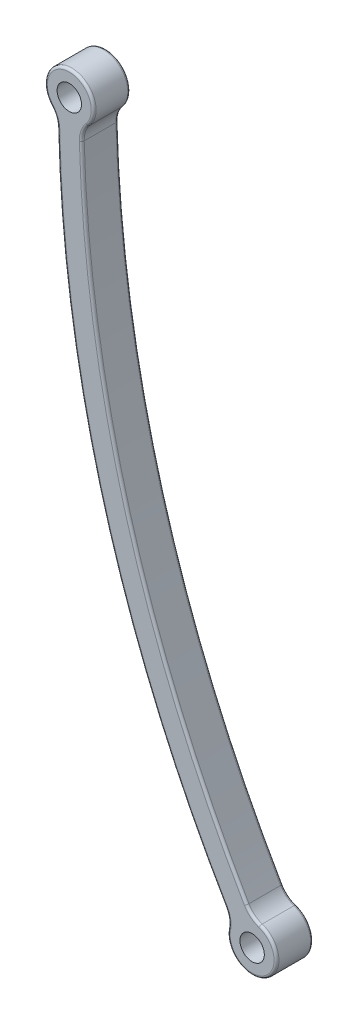
ISO-10303-21;
HEADER;
FILE_DESCRIPTION(('STEP AP214'),'2;1');
FILE_NAME('part.step','',(''),(''),'','','');
FILE_SCHEMA(('AUTOMOTIVE_DESIGN { 1 0 10303 214 1 1 1 1 }'));
ENDSEC;
DATA;
#1=APPLICATION_CONTEXT('core data for automotive mechanical design processes');
#2=APPLICATION_PROTOCOL_DEFINITION('international standard','automotive_design',2000,#1);
#3=PRODUCT_CONTEXT('',#1,'mechanical');
#4=PRODUCT('Part','Part','',(#3));
#5=PRODUCT_RELATED_PRODUCT_CATEGORY('part','',(#4));
#6=PRODUCT_DEFINITION_FORMATION('','',#4);
#7=PRODUCT_DEFINITION_CONTEXT('part definition',#1,'design');
#8=PRODUCT_DEFINITION('design','',#6,#7);
#9=PRODUCT_DEFINITION_SHAPE('','',#8);
#10=(LENGTH_UNIT() NAMED_UNIT(*) SI_UNIT(.MILLI.,.METRE.));
#11=(NAMED_UNIT(*) PLANE_ANGLE_UNIT() SI_UNIT($,.RADIAN.));
#12=(NAMED_UNIT(*) SI_UNIT($,.STERADIAN.) SOLID_ANGLE_UNIT());
#13=UNCERTAINTY_MEASURE_WITH_UNIT(LENGTH_MEASURE(1.E-05),#10,'distance_accuracy_value','');
#14=(GEOMETRIC_REPRESENTATION_CONTEXT(3) GLOBAL_UNCERTAINTY_ASSIGNED_CONTEXT((#13)) GLOBAL_UNIT_ASSIGNED_CONTEXT((#10,
#11,#12)) REPRESENTATION_CONTEXT('',''));
#15=CARTESIAN_POINT('',(0.,0.,0.));
#16=DIRECTION('',(0.,0.,1.));
#17=DIRECTION('',(1.,0.,0.));
#18=AXIS2_PLACEMENT_3D('',#15,#16,#17);
#19=CARTESIAN_POINT('',(169.976363638704,84.6763004013927,2.8575));
#20=DIRECTION('',(0.,0.,-1.));
#21=DIRECTION('',(-1.,0.,0.));
#22=AXIS2_PLACEMENT_3D('',#19,#20,#21);
#23=CYLINDRICAL_SURFACE('',#22,190.5);
#24=DIRECTION('',(0.,0.,-1.));
#25=VECTOR('',#24,1.);
#26=CARTESIAN_POINT('',(5.29631042957664,-11.0876284812449,2.8575));
#27=LINE('',#26,#25);
#28=CARTESIAN_POINT('',(5.29631042957664,-11.0876284812449,2.4765));
#29=VERTEX_POINT('',#28);
#30=CARTESIAN_POINT('',(5.29631042957664,-11.0876284812449,-2.4765));
#31=VERTEX_POINT('',#30);
#32=EDGE_CURVE('E346',#29,#31,#27,.T.);
#33=ORIENTED_EDGE('',*,*,#32,.T.);
#34=CARTESIAN_POINT('',(169.976363638704,84.6763004013927,-2.4765));
#35=DIRECTION('',(0.,0.,1.));
#36=DIRECTION('',(1.,0.,0.));
#37=AXIS2_PLACEMENT_3D('',#34,#35,#36);
#38=CIRCLE('',#37,190.5);
#39=CARTESIAN_POINT('',(-20.4477821309873,79.300920611718,-2.4765));
#40=VERTEX_POINT('',#39);
#41=EDGE_CURVE('E11',#31,#40,#38,.F.);
#42=ORIENTED_EDGE('',*,*,#41,.T.);
#43=DIRECTION('',(0.,0.,-1.));
#44=VECTOR('',#43,1.);
#45=CARTESIAN_POINT('',(-20.4477821309873,79.300920611718,2.8575));
#46=LINE('',#45,#44);
#47=CARTESIAN_POINT('',(-20.4477821309873,79.300920611718,2.4765));
#48=VERTEX_POINT('',#47);
#49=EDGE_CURVE('E328',#40,#48,#46,.F.);
#50=ORIENTED_EDGE('',*,*,#49,.T.);
#51=CARTESIAN_POINT('',(169.976363638704,84.6763004013927,2.4765));
#52=DIRECTION('',(0.,0.,1.));
#53=DIRECTION('',(1.,0.,0.));
#54=AXIS2_PLACEMENT_3D('',#51,#52,#53);
#55=CIRCLE('',#54,190.5);
#56=EDGE_CURVE('E49',#48,#29,#55,.T.);
#57=ORIENTED_EDGE('',*,*,#56,.T.);
#58=EDGE_LOOP('',(#33,#42,#50,#57));
#59=FACE_BOUND('',#58,.T.);
#60=ADVANCED_FACE('F40',(#59),#23,.F.);
#61=CARTESIAN_POINT('',(-22.3951085899308,84.4019298292485,2.8575));
#62=DIRECTION('',(0.,0.,-1.));
#63=DIRECTION('',(-1.,0.,0.));
#64=AXIS2_PLACEMENT_3D('',#61,#62,#63);
#65=CYLINDRICAL_SURFACE('',#64,3.80999999999999);
#66=DIRECTION('',(0.,0.,-1.));
#67=VECTOR('',#66,1.);
#68=CARTESIAN_POINT('',(-19.5172039027621,81.90517901838,2.8575));
#69=LINE('',#68,#67);
#70=CARTESIAN_POINT('',(-19.5172039027621,81.90517901838,2.4765));
#71=VERTEX_POINT('',#70);
#72=CARTESIAN_POINT('',(-19.5172039027621,81.90517901838,-2.4765));
#73=VERTEX_POINT('',#72);
#74=EDGE_CURVE('E294',#71,#73,#69,.T.);
#75=ORIENTED_EDGE('',*,*,#74,.T.);
#76=CARTESIAN_POINT('',(-22.3951085899308,84.4019298292485,-2.4765));
#77=DIRECTION('',(0.,0.,1.));
#78=DIRECTION('',(1.,0.,0.));
#79=AXIS2_PLACEMENT_3D('',#76,#77,#78);
#80=CIRCLE('',#79,3.80999999999999);
#81=CARTESIAN_POINT('',(-25.2373170798735,81.8646180825966,-2.4765));
#82=VERTEX_POINT('',#81);
#83=EDGE_CURVE('E194',#73,#82,#80,.T.);
#84=ORIENTED_EDGE('',*,*,#83,.T.);
#85=DIRECTION('',(0.,0.,-1.));
#86=VECTOR('',#85,1.);
#87=CARTESIAN_POINT('',(-25.2373170798735,81.8646180825966,2.8575));
#88=LINE('',#87,#86);
#89=CARTESIAN_POINT('',(-25.2373170798735,81.8646180825966,2.4765));
#90=VERTEX_POINT('',#89);
#91=EDGE_CURVE('E176',#82,#90,#88,.F.);
#92=ORIENTED_EDGE('',*,*,#91,.T.);
#93=CARTESIAN_POINT('',(-22.3951085899308,84.4019298292485,2.4765));
#94=DIRECTION('',(0.,0.,1.));
#95=DIRECTION('',(1.,0.,0.));
#96=AXIS2_PLACEMENT_3D('',#93,#94,#95);
#97=CIRCLE('',#96,3.80999999999999);
#98=EDGE_CURVE('E192',#90,#71,#97,.F.);
#99=ORIENTED_EDGE('',*,*,#98,.T.);
#100=EDGE_LOOP('',(#75,#84,#92,#99));
#101=FACE_BOUND('',#100,.T.);
#102=ADVANCED_FACE('F329',(#101),#65,.T.);
#103=CARTESIAN_POINT('',(166.183554718762,83.5971701268951,2.8575));
#104=DIRECTION('',(0.,0.,-1.));
#105=DIRECTION('',(-1.,0.,0.));
#106=AXIS2_PLACEMENT_3D('',#103,#104,#105);
#107=CYLINDRICAL_SURFACE('',#106,190.5);
#108=DIRECTION('',(0.,0.,-1.));
#109=VECTOR('',#108,1.);
#110=CARTESIAN_POINT('',(-24.2704455641583,79.4110291553747,2.8575));
#111=LINE('',#110,#109);
#112=CARTESIAN_POINT('',(-24.2704455641583,79.4110291553747,2.4765));
#113=VERTEX_POINT('',#112);
#114=CARTESIAN_POINT('',(-24.2704455641583,79.4110291553747,-2.4765));
#115=VERTEX_POINT('',#114);
#116=EDGE_CURVE('E295',#113,#115,#111,.T.);
#117=ORIENTED_EDGE('',*,*,#116,.T.);
#118=CARTESIAN_POINT('',(166.183554718762,83.5971701268951,-2.4765));
#119=DIRECTION('',(0.,0.,1.));
#120=DIRECTION('',(1.,0.,0.));
#121=AXIS2_PLACEMENT_3D('',#118,#119,#120);
#122=CIRCLE('',#121,190.5);
#123=CARTESIAN_POINT('',(1.98783235250412,-12.9948313878411,-2.4765));
#124=VERTEX_POINT('',#123);
#125=EDGE_CURVE('E202',#115,#124,#122,.T.);
#126=ORIENTED_EDGE('',*,*,#125,.T.);
#127=DIRECTION('',(0.,0.,-1.));
#128=VECTOR('',#127,1.);
#129=CARTESIAN_POINT('',(1.98783235250412,-12.9948313878411,2.8575));
#130=LINE('',#129,#128);
#131=CARTESIAN_POINT('',(1.98783235250412,-12.9948313878411,2.4765));
#132=VERTEX_POINT('',#131);
#133=EDGE_CURVE('E285',#124,#132,#130,.F.);
#134=ORIENTED_EDGE('',*,*,#133,.T.);
#135=CARTESIAN_POINT('',(166.183554718762,83.5971701268951,2.4765));
#136=DIRECTION('',(0.,0.,1.));
#137=DIRECTION('',(1.,0.,0.));
#138=AXIS2_PLACEMENT_3D('',#135,#136,#137);
#139=CIRCLE('',#138,190.5);
#140=EDGE_CURVE('E200',#132,#113,#139,.F.);
#141=ORIENTED_EDGE('',*,*,#140,.T.);
#142=EDGE_LOOP('',(#117,#126,#134,#141));
#143=FACE_BOUND('',#142,.T.);
#144=ADVANCED_FACE('F291',(#143),#107,.T.);
#145=CARTESIAN_POINT('',(-22.3951085899308,84.4019298292485,2.8575));
#146=DIRECTION('',(0.,0.,-1.));
#147=DIRECTION('',(-1.,0.,0.));
#148=AXIS2_PLACEMENT_3D('',#145,#146,#147);
#149=CYLINDRICAL_SURFACE('',#148,1.90500000000001);
#150=CARTESIAN_POINT('',(-22.3951085899308,84.4019298292485,2.8575));
#151=DIRECTION('',(0.,0.,1.));
#152=DIRECTION('',(1.,0.,0.));
#153=AXIS2_PLACEMENT_3D('',#150,#151,#152);
#154=CIRCLE('',#153,1.90500000000001);
#155=CARTESIAN_POINT('',(-24.3001085899308,84.4019298292485,2.8575));
#156=VERTEX_POINT('',#155);
#157=EDGE_CURVE('E351',#156,#156,#154,.T.);
#158=CARTESIAN_POINT('',(-22.3951085899308,84.4019298292485,-2.8575));
#159=DIRECTION('',(0.,0.,1.));
#160=DIRECTION('',(1.,0.,0.));
#161=AXIS2_PLACEMENT_3D('',#158,#159,#160);
#162=CIRCLE('',#161,1.90500000000001);
#163=CARTESIAN_POINT('',(-24.3001085899308,84.4019298292485,-2.8575));
#164=VERTEX_POINT('',#163);
#165=EDGE_CURVE('E249',#164,#164,#162,.T.);
#166=CARTESIAN_POINT('',(-24.3001085899308,84.4019298292485,2.8575));
#167=CARTESIAN_POINT('',(-24.3001085899308,84.4019298292485,2.79796875));
#168=CARTESIAN_POINT('',(-24.3001085899308,84.4019298292485,2.7384375));
#169=CARTESIAN_POINT('',(-24.3001085899308,84.4019298292485,2.619375));
#170=CARTESIAN_POINT('',(-24.3001085899308,84.4019298292485,2.55984375));
#171=CARTESIAN_POINT('',(-24.3001085899308,84.4019298292485,2.44078125));
#172=CARTESIAN_POINT('',(-24.3001085899308,84.4019298292485,2.38125));
#173=CARTESIAN_POINT('',(-24.3001085899308,84.4019298292485,2.2621875));
#174=CARTESIAN_POINT('',(-24.3001085899308,84.4019298292485,2.20265625));
#175=CARTESIAN_POINT('',(-24.3001085899308,84.4019298292485,2.08359375));
#176=CARTESIAN_POINT('',(-24.3001085899308,84.4019298292485,2.0240625));
#177=CARTESIAN_POINT('',(-24.3001085899308,84.4019298292485,1.905));
#178=CARTESIAN_POINT('',(-24.3001085899308,84.4019298292485,1.84546875));
#179=CARTESIAN_POINT('',(-24.3001085899308,84.4019298292485,1.72640625));
#180=CARTESIAN_POINT('',(-24.3001085899308,84.4019298292485,1.666875));
#181=CARTESIAN_POINT('',(-24.3001085899308,84.4019298292485,1.5478125));
#182=CARTESIAN_POINT('',(-24.3001085899308,84.4019298292485,1.48828125));
#183=CARTESIAN_POINT('',(-24.3001085899308,84.4019298292485,1.36921875));
#184=CARTESIAN_POINT('',(-24.3001085899308,84.4019298292485,1.3096875));
#185=CARTESIAN_POINT('',(-24.3001085899308,84.4019298292485,1.190625));
#186=CARTESIAN_POINT('',(-24.3001085899308,84.4019298292485,1.13109375));
#187=CARTESIAN_POINT('',(-24.3001085899308,84.4019298292485,1.01203125));
#188=CARTESIAN_POINT('',(-24.3001085899308,84.4019298292485,0.952499999999999));
#189=CARTESIAN_POINT('',(-24.3001085899308,84.4019298292485,0.833437499999999));
#190=CARTESIAN_POINT('',(-24.3001085899308,84.4019298292485,0.773906249999999));
#191=CARTESIAN_POINT('',(-24.3001085899308,84.4019298292485,0.654843749999999));
#192=CARTESIAN_POINT('',(-24.3001085899308,84.4019298292485,0.595312499999999));
#193=CARTESIAN_POINT('',(-24.3001085899308,84.4019298292485,0.476249999999999));
#194=CARTESIAN_POINT('',(-24.3001085899308,84.4019298292485,0.416718749999999));
#195=CARTESIAN_POINT('',(-24.3001085899308,84.4019298292485,0.297656249999999));
#196=CARTESIAN_POINT('',(-24.3001085899308,84.4019298292485,0.238124999999999));
#197=CARTESIAN_POINT('',(-24.3001085899308,84.4019298292485,0.1190625));
#198=CARTESIAN_POINT('',(-24.3001085899308,84.4019298292485,0.0595312499999995));
#199=CARTESIAN_POINT('',(-24.3001085899308,84.4019298292485,-0.0595312500000004));
#200=CARTESIAN_POINT('',(-24.3001085899308,84.4019298292485,-0.1190625));
#201=CARTESIAN_POINT('',(-24.3001085899308,84.4019298292485,-0.238125));
#202=CARTESIAN_POINT('',(-24.3001085899308,84.4019298292485,-0.29765625));
#203=CARTESIAN_POINT('',(-24.3001085899308,84.4019298292485,-0.41671875));
#204=CARTESIAN_POINT('',(-24.3001085899308,84.4019298292485,-0.47625));
#205=CARTESIAN_POINT('',(-24.3001085899308,84.4019298292485,-0.5953125));
#206=CARTESIAN_POINT('',(-24.3001085899308,84.4019298292485,-0.65484375));
#207=CARTESIAN_POINT('',(-24.3001085899308,84.4019298292485,-0.77390625));
#208=CARTESIAN_POINT('',(-24.3001085899308,84.4019298292485,-0.8334375));
#209=CARTESIAN_POINT('',(-24.3001085899308,84.4019298292485,-0.9525));
#210=CARTESIAN_POINT('',(-24.3001085899308,84.4019298292485,-1.01203125));
#211=CARTESIAN_POINT('',(-24.3001085899308,84.4019298292485,-1.13109375));
#212=CARTESIAN_POINT('',(-24.3001085899308,84.4019298292485,-1.190625));
#213=CARTESIAN_POINT('',(-24.3001085899308,84.4019298292485,-1.3096875));
#214=CARTESIAN_POINT('',(-24.3001085899308,84.4019298292485,-1.36921875));
#215=CARTESIAN_POINT('',(-24.3001085899308,84.4019298292485,-1.48828125));
#216=CARTESIAN_POINT('',(-24.3001085899308,84.4019298292485,-1.5478125));
#217=CARTESIAN_POINT('',(-24.3001085899308,84.4019298292485,-1.666875));
#218=CARTESIAN_POINT('',(-24.3001085899308,84.4019298292485,-1.72640625));
#219=CARTESIAN_POINT('',(-24.3001085899308,84.4019298292485,-1.84546875));
#220=CARTESIAN_POINT('',(-24.3001085899308,84.4019298292485,-1.905));
#221=CARTESIAN_POINT('',(-24.3001085899308,84.4019298292485,-2.0240625));
#222=CARTESIAN_POINT('',(-24.3001085899308,84.4019298292485,-2.08359375));
#223=CARTESIAN_POINT('',(-24.3001085899308,84.4019298292485,-2.20265625));
#224=CARTESIAN_POINT('',(-24.3001085899308,84.4019298292485,-2.2621875));
#225=CARTESIAN_POINT('',(-24.3001085899308,84.4019298292485,-2.38125));
#226=CARTESIAN_POINT('',(-24.3001085899308,84.4019298292485,-2.44078125));
#227=CARTESIAN_POINT('',(-24.3001085899308,84.4019298292485,-2.55984375));
#228=CARTESIAN_POINT('',(-24.3001085899308,84.4019298292485,-2.619375));
#229=CARTESIAN_POINT('',(-24.3001085899308,84.4019298292485,-2.7384375));
#230=CARTESIAN_POINT('',(-24.3001085899308,84.4019298292485,-2.79796875));
#231=CARTESIAN_POINT('',(-24.3001085899308,84.4019298292485,-2.8575));
#232=B_SPLINE_CURVE_WITH_KNOTS('',3,(#166,#167,#168,#169,#170,#171,#172,#173,#174,#175,#176,
#177,#178,#179,#180,#181,#182,#183,#184,#185,#186,#187,#188,#189,#190,#191,#192,#193,#194,#195,
#196,#197,#198,#199,#200,#201,#202,#203,#204,#205,#206,#207,#208,#209,#210,#211,#212,#213,#214,
#215,#216,#217,#218,#219,#220,#221,#222,#223,#224,#225,#226,#227,#228,#229,#230,#231),
.UNSPECIFIED.,.F.,.F.,(4,2,2,2,2,2,2,2,2,2,2,2,2,2,2,2,2,2,2,2,2,2,2,2,2,2,2,2,2,2,2,2,4),(0.,
0.17859375,0.3571875,0.53578125,0.714375,0.89296875,1.0715625,1.25015625,1.42875,1.60734375,
1.7859375,1.96453125,2.143125,2.32171875,2.5003125,2.67890625,2.8575,3.03609375,3.2146875,
3.39328125,3.571875,3.75046875,3.9290625,4.10765625,4.28625,4.46484375,4.6434375,4.82203125,
5.000625,5.17921875,5.3578125,5.53640625,5.715),.UNSPECIFIED.);
#233=EDGE_CURVE('BSEAM584',#156,#164,#232,.T.);
#234=ORIENTED_EDGE('',*,*,#157,.T.);
#235=ORIENTED_EDGE('',*,*,#165,.F.);
#236=ORIENTED_EDGE('',*,*,#233,.T.);
#237=ORIENTED_EDGE('',*,*,#233,.F.);
#238=EDGE_LOOP('',(#234,#236,#235,#237));
#239=FACE_BOUND('',#238,.T.);
#240=ADVANCED_FACE('F584',(#239),#149,.F.);
#241=CARTESIAN_POINT('',(6.17989141006925,-16.4011951223124,2.8575));
#242=DIRECTION('',(0.,0.,-1.));
#243=DIRECTION('',(-1.,0.,0.));
#244=AXIS2_PLACEMENT_3D('',#241,#242,#243);
#245=CYLINDRICAL_SURFACE('',#244,3.81);
#246=DIRECTION('',(0.,0.,-1.));
#247=VECTOR('',#246,1.);
#248=CARTESIAN_POINT('',(2.44190465762411,-15.6639332702241,2.8575));
#249=LINE('',#248,#247);
#250=CARTESIAN_POINT('',(2.44190465762411,-15.6639332702241,2.4765));
#251=VERTEX_POINT('',#250);
#252=CARTESIAN_POINT('',(2.44190465762411,-15.6639332702241,-2.4765));
#253=VERTEX_POINT('',#252);
#254=EDGE_CURVE('E288',#251,#253,#249,.T.);
#255=ORIENTED_EDGE('',*,*,#254,.T.);
#256=CARTESIAN_POINT('',(6.17989141006925,-16.4011951223124,-2.4765));
#257=DIRECTION('',(0.,0.,1.));
#258=DIRECTION('',(1.,0.,0.));
#259=AXIS2_PLACEMENT_3D('',#256,#257,#258);
#260=CIRCLE('',#259,3.81);
#261=CARTESIAN_POINT('',(7.38490145191419,-12.7867725129524,-2.4765));
#262=VERTEX_POINT('',#261);
#263=EDGE_CURVE('E210',#253,#262,#260,.T.);
#264=ORIENTED_EDGE('',*,*,#263,.T.);
#265=DIRECTION('',(0.,0.,-1.));
#266=VECTOR('',#265,1.);
#267=CARTESIAN_POINT('',(7.38490145191419,-12.7867725129524,2.8575));
#268=LINE('',#267,#266);
#269=CARTESIAN_POINT('',(7.38490145191419,-12.7867725129524,2.4765));
#270=VERTEX_POINT('',#269);
#271=EDGE_CURVE('E299',#262,#270,#268,.F.);
#272=ORIENTED_EDGE('',*,*,#271,.T.);
#273=CARTESIAN_POINT('',(6.17989141006925,-16.4011951223124,2.4765));
#274=DIRECTION('',(0.,0.,1.));
#275=DIRECTION('',(1.,0.,0.));
#276=AXIS2_PLACEMENT_3D('',#273,#274,#275);
#277=CIRCLE('',#276,3.81);
#278=EDGE_CURVE('E208',#270,#251,#277,.F.);
#279=ORIENTED_EDGE('',*,*,#278,.T.);
#280=EDGE_LOOP('',(#255,#264,#272,#279));
#281=FACE_BOUND('',#280,.T.);
#282=ADVANCED_FACE('F360',(#281),#245,.T.);
#283=CARTESIAN_POINT('',(6.17989141006925,-16.4011951223124,2.8575));
#284=DIRECTION('',(0.,0.,-1.));
#285=DIRECTION('',(-1.,0.,0.));
#286=AXIS2_PLACEMENT_3D('',#283,#284,#285);
#287=CYLINDRICAL_SURFACE('',#286,1.905);
#288=CARTESIAN_POINT('',(6.17989141006925,-16.4011951223124,2.8575));
#289=DIRECTION('',(0.,0.,1.));
#290=DIRECTION('',(1.,0.,0.));
#291=AXIS2_PLACEMENT_3D('',#288,#289,#290);
#292=CIRCLE('',#291,1.905);
#293=CARTESIAN_POINT('',(4.27489141006925,-16.4011951223124,2.8575));
#294=VERTEX_POINT('',#293);
#295=EDGE_CURVE('E347',#294,#294,#292,.T.);
#296=CARTESIAN_POINT('',(6.17989141006925,-16.4011951223124,-2.8575));
#297=DIRECTION('',(0.,0.,1.));
#298=DIRECTION('',(1.,0.,0.));
#299=AXIS2_PLACEMENT_3D('',#296,#297,#298);
#300=CIRCLE('',#299,1.905);
#301=CARTESIAN_POINT('',(4.27489141006925,-16.4011951223124,-2.8575));
#302=VERTEX_POINT('',#301);
#303=EDGE_CURVE('E354',#302,#302,#300,.T.);
#304=CARTESIAN_POINT('',(4.27489141006925,-16.4011951223124,2.8575));
#305=CARTESIAN_POINT('',(4.27489141006925,-16.4011951223124,2.79796875));
#306=CARTESIAN_POINT('',(4.27489141006925,-16.4011951223124,2.7384375));
#307=CARTESIAN_POINT('',(4.27489141006925,-16.4011951223124,2.619375));
#308=CARTESIAN_POINT('',(4.27489141006925,-16.4011951223124,2.55984375));
#309=CARTESIAN_POINT('',(4.27489141006925,-16.4011951223124,2.44078125));
#310=CARTESIAN_POINT('',(4.27489141006925,-16.4011951223124,2.38125));
#311=CARTESIAN_POINT('',(4.27489141006925,-16.4011951223124,2.2621875));
#312=CARTESIAN_POINT('',(4.27489141006925,-16.4011951223124,2.20265625));
#313=CARTESIAN_POINT('',(4.27489141006925,-16.4011951223124,2.08359375));
#314=CARTESIAN_POINT('',(4.27489141006925,-16.4011951223124,2.0240625));
#315=CARTESIAN_POINT('',(4.27489141006925,-16.4011951223124,1.905));
#316=CARTESIAN_POINT('',(4.27489141006925,-16.4011951223124,1.84546875));
#317=CARTESIAN_POINT('',(4.27489141006925,-16.4011951223124,1.72640625));
#318=CARTESIAN_POINT('',(4.27489141006925,-16.4011951223124,1.666875));
#319=CARTESIAN_POINT('',(4.27489141006925,-16.4011951223124,1.5478125));
#320=CARTESIAN_POINT('',(4.27489141006925,-16.4011951223124,1.48828125));
#321=CARTESIAN_POINT('',(4.27489141006925,-16.4011951223124,1.36921875));
#322=CARTESIAN_POINT('',(4.27489141006925,-16.4011951223124,1.3096875));
#323=CARTESIAN_POINT('',(4.27489141006925,-16.4011951223124,1.190625));
#324=CARTESIAN_POINT('',(4.27489141006925,-16.4011951223124,1.13109375));
#325=CARTESIAN_POINT('',(4.27489141006925,-16.4011951223124,1.01203125));
#326=CARTESIAN_POINT('',(4.27489141006925,-16.4011951223124,0.952499999999999));
#327=CARTESIAN_POINT('',(4.27489141006925,-16.4011951223124,0.833437499999999));
#328=CARTESIAN_POINT('',(4.27489141006925,-16.4011951223124,0.773906249999999));
#329=CARTESIAN_POINT('',(4.27489141006925,-16.4011951223124,0.654843749999999));
#330=CARTESIAN_POINT('',(4.27489141006925,-16.4011951223124,0.595312499999999));
#331=CARTESIAN_POINT('',(4.27489141006925,-16.4011951223124,0.476249999999999));
#332=CARTESIAN_POINT('',(4.27489141006925,-16.4011951223124,0.416718749999999));
#333=CARTESIAN_POINT('',(4.27489141006925,-16.4011951223124,0.297656249999999));
#334=CARTESIAN_POINT('',(4.27489141006925,-16.4011951223124,0.238124999999999));
#335=CARTESIAN_POINT('',(4.27489141006925,-16.4011951223124,0.1190625));
#336=CARTESIAN_POINT('',(4.27489141006925,-16.4011951223124,0.0595312499999995));
#337=CARTESIAN_POINT('',(4.27489141006925,-16.4011951223124,-0.0595312500000004));
#338=CARTESIAN_POINT('',(4.27489141006925,-16.4011951223124,-0.1190625));
#339=CARTESIAN_POINT('',(4.27489141006925,-16.4011951223124,-0.238125));
#340=CARTESIAN_POINT('',(4.27489141006925,-16.4011951223124,-0.29765625));
#341=CARTESIAN_POINT('',(4.27489141006925,-16.4011951223124,-0.41671875));
#342=CARTESIAN_POINT('',(4.27489141006925,-16.4011951223124,-0.47625));
#343=CARTESIAN_POINT('',(4.27489141006925,-16.4011951223124,-0.5953125));
#344=CARTESIAN_POINT('',(4.27489141006925,-16.4011951223124,-0.65484375));
#345=CARTESIAN_POINT('',(4.27489141006925,-16.4011951223124,-0.77390625));
#346=CARTESIAN_POINT('',(4.27489141006925,-16.4011951223124,-0.8334375));
#347=CARTESIAN_POINT('',(4.27489141006925,-16.4011951223124,-0.9525));
#348=CARTESIAN_POINT('',(4.27489141006925,-16.4011951223124,-1.01203125));
#349=CARTESIAN_POINT('',(4.27489141006925,-16.4011951223124,-1.13109375));
#350=CARTESIAN_POINT('',(4.27489141006925,-16.4011951223124,-1.190625));
#351=CARTESIAN_POINT('',(4.27489141006925,-16.4011951223124,-1.3096875));
#352=CARTESIAN_POINT('',(4.27489141006925,-16.4011951223124,-1.36921875));
#353=CARTESIAN_POINT('',(4.27489141006925,-16.4011951223124,-1.48828125));
#354=CARTESIAN_POINT('',(4.27489141006925,-16.4011951223124,-1.5478125));
#355=CARTESIAN_POINT('',(4.27489141006925,-16.4011951223124,-1.666875));
#356=CARTESIAN_POINT('',(4.27489141006925,-16.4011951223124,-1.72640625));
#357=CARTESIAN_POINT('',(4.27489141006925,-16.4011951223124,-1.84546875));
#358=CARTESIAN_POINT('',(4.27489141006925,-16.4011951223124,-1.905));
#359=CARTESIAN_POINT('',(4.27489141006925,-16.4011951223124,-2.0240625));
#360=CARTESIAN_POINT('',(4.27489141006925,-16.4011951223124,-2.08359375));
#361=CARTESIAN_POINT('',(4.27489141006925,-16.4011951223124,-2.20265625));
#362=CARTESIAN_POINT('',(4.27489141006925,-16.4011951223124,-2.2621875));
#363=CARTESIAN_POINT('',(4.27489141006925,-16.4011951223124,-2.38125));
#364=CARTESIAN_POINT('',(4.27489141006925,-16.4011951223124,-2.44078125));
#365=CARTESIAN_POINT('',(4.27489141006925,-16.4011951223124,-2.55984375));
#366=CARTESIAN_POINT('',(4.27489141006925,-16.4011951223124,-2.619375));
#367=CARTESIAN_POINT('',(4.27489141006925,-16.4011951223124,-2.7384375));
#368=CARTESIAN_POINT('',(4.27489141006925,-16.4011951223124,-2.79796875));
#369=CARTESIAN_POINT('',(4.27489141006925,-16.4011951223124,-2.8575));
#370=B_SPLINE_CURVE_WITH_KNOTS('',3,(#304,#305,#306,#307,#308,#309,#310,#311,#312,#313,#314,
#315,#316,#317,#318,#319,#320,#321,#322,#323,#324,#325,#326,#327,#328,#329,#330,#331,#332,#333,
#334,#335,#336,#337,#338,#339,#340,#341,#342,#343,#344,#345,#346,#347,#348,#349,#350,#351,#352,
#353,#354,#355,#356,#357,#358,#359,#360,#361,#362,#363,#364,#365,#366,#367,#368,#369),
.UNSPECIFIED.,.F.,.F.,(4,2,2,2,2,2,2,2,2,2,2,2,2,2,2,2,2,2,2,2,2,2,2,2,2,2,2,2,2,2,2,2,4),(0.,
0.17859375,0.3571875,0.53578125,0.714375,0.89296875,1.0715625,1.25015625,1.42875,1.60734375,
1.7859375,1.96453125,2.143125,2.32171875,2.5003125,2.67890625,2.8575,3.03609375,3.2146875,
3.39328125,3.571875,3.75046875,3.9290625,4.10765625,4.28625,4.46484375,4.6434375,4.82203125,
5.000625,5.17921875,5.3578125,5.53640625,5.715),.UNSPECIFIED.);
#371=EDGE_CURVE('BSEAM563',#294,#302,#370,.T.);
#372=ORIENTED_EDGE('',*,*,#295,.T.);
#373=ORIENTED_EDGE('',*,*,#303,.F.);
#374=ORIENTED_EDGE('',*,*,#371,.T.);
#375=ORIENTED_EDGE('',*,*,#371,.F.);
#376=EDGE_LOOP('',(#372,#374,#373,#375));
#377=FACE_BOUND('',#376,.T.);
#378=ADVANCED_FACE('F563',(#377),#287,.F.);
#379=CARTESIAN_POINT('',(6.17989141006925,-16.4011951223124,2.8575));
#380=DIRECTION('',(0.,0.,1.));
#381=DIRECTION('',(1.,0.,0.));
#382=AXIS2_PLACEMENT_3D('',#379,#380,#381);
#383=PLANE('',#382);
#384=CARTESIAN_POINT('',(169.976363638704,84.6763004013927,2.8575));
#385=DIRECTION('',(0.,0.,1.));
#386=DIRECTION('',(1.,0.,0.));
#387=AXIS2_PLACEMENT_3D('',#384,#385,#386);
#388=CIRCLE('',#387,190.881);
#389=CARTESIAN_POINT('',(4.96695032315838,-11.2791563390102,2.8575));
#390=VERTEX_POINT('',#389);
#391=CARTESIAN_POINT('',(-20.8286304225267,79.2901698521387,2.8575));
#392=VERTEX_POINT('',#391);
#393=EDGE_CURVE('E216',#390,#392,#388,.F.);
#394=ORIENTED_EDGE('',*,*,#393,.T.);
#395=CARTESIAN_POINT('',(-16.6392992155934,79.4084282075115,2.8575));
#396=DIRECTION('',(0.,0.,1.));
#397=DIRECTION('',(1.,0.,0.));
#398=AXIS2_PLACEMENT_3D('',#395,#396,#397);
#399=CIRCLE('',#398,4.191);
#400=CARTESIAN_POINT('',(-19.804994371479,82.1548540994668,2.8575));
#401=VERTEX_POINT('',#400);
#402=EDGE_CURVE('E229',#392,#401,#399,.F.);
#403=ORIENTED_EDGE('',*,*,#402,.T.);
#404=CARTESIAN_POINT('',(-22.3951085899308,84.4019298292485,2.8575));
#405=DIRECTION('',(0.,0.,1.));
#406=DIRECTION('',(1.,0.,0.));
#407=AXIS2_PLACEMENT_3D('',#404,#405,#406);
#408=CIRCLE('',#407,3.42899999999999);
#409=CARTESIAN_POINT('',(-24.9530962308798,82.1183492572613,2.8575));
#410=VERTEX_POINT('',#409);
#411=EDGE_CURVE('E64',#401,#410,#408,.T.);
#412=ORIENTED_EDGE('',*,*,#411,.T.);
#413=CARTESIAN_POINT('',(-28.0795255698168,79.3273063359443,2.8575));
#414=DIRECTION('',(0.,0.,1.));
#415=DIRECTION('',(1.,0.,0.));
#416=AXIS2_PLACEMENT_3D('',#413,#414,#415);
#417=CIRCLE('',#416,4.191);
#418=CARTESIAN_POINT('',(-23.8895375635925,79.4194014373177,2.8575));
#419=VERTEX_POINT('',#418);
#420=EDGE_CURVE('E226',#410,#419,#417,.F.);
#421=ORIENTED_EDGE('',*,*,#420,.T.);
#422=CARTESIAN_POINT('',(166.183554718762,83.5971701268951,2.8575));
#423=DIRECTION('',(0.,0.,1.));
#424=DIRECTION('',(1.,0.,0.));
#425=AXIS2_PLACEMENT_3D('',#422,#423,#424);
#426=CIRCLE('',#425,190.119);
#427=CARTESIAN_POINT('',(2.31622379723665,-12.8016473848116,2.8575));
#428=VERTEX_POINT('',#427);
#429=EDGE_CURVE('E224',#419,#428,#426,.T.);
#430=ORIENTED_EDGE('',*,*,#429,.T.);
#431=CARTESIAN_POINT('',(-1.29608209482103,-14.9266714181358,2.8575));
#432=DIRECTION('',(0.,0.,1.));
#433=DIRECTION('',(1.,0.,0.));
#434=AXIS2_PLACEMENT_3D('',#431,#432,#433);
#435=CIRCLE('',#434,4.191);
#436=CARTESIAN_POINT('',(2.81570333286862,-15.7376594554329,2.8575));
#437=VERTEX_POINT('',#436);
#438=EDGE_CURVE('E222',#428,#437,#435,.F.);
#439=ORIENTED_EDGE('',*,*,#438,.T.);
#440=CARTESIAN_POINT('',(6.17989141006925,-16.4011951223124,2.8575));
#441=DIRECTION('',(0.,0.,1.));
#442=DIRECTION('',(1.,0.,0.));
#443=AXIS2_PLACEMENT_3D('',#440,#441,#442);
#444=CIRCLE('',#443,3.429);
#445=CARTESIAN_POINT('',(7.26440044772975,-13.1482147738882,2.8575));
#446=VERTEX_POINT('',#445);
#447=EDGE_CURVE('E220',#437,#446,#444,.T.);
#448=ORIENTED_EDGE('',*,*,#447,.T.);
#449=CARTESIAN_POINT('',(8.58991149375919,-9.17234990359216,2.8575));
#450=DIRECTION('',(0.,0.,1.));
#451=DIRECTION('',(1.,0.,0.));
#452=AXIS2_PLACEMENT_3D('',#449,#450,#451);
#453=CIRCLE('',#452,4.191);
#454=EDGE_CURVE('E218',#446,#390,#453,.F.);
#455=ORIENTED_EDGE('',*,*,#454,.T.);
#456=EDGE_LOOP('',(#394,#403,#412,#421,#430,#439,#448,#455));
#457=FACE_BOUND('',#456,.T.);
#458=ORIENTED_EDGE('',*,*,#157,.F.);
#459=EDGE_LOOP('',(#458));
#460=FACE_BOUND('',#459,.T.);
#461=ORIENTED_EDGE('',*,*,#295,.F.);
#462=EDGE_LOOP('',(#461));
#463=FACE_BOUND('',#462,.T.);
#464=ADVANCED_FACE('F334',(#457,#460,#463),#383,.T.);
#465=CARTESIAN_POINT('',(6.17989141006925,-16.4011951223124,-2.8575));
#466=DIRECTION('',(0.,0.,1.));
#467=DIRECTION('',(1.,0.,0.));
#468=AXIS2_PLACEMENT_3D('',#465,#466,#467);
#469=PLANE('',#468);
#470=CARTESIAN_POINT('',(-22.3951085899308,84.4019298292485,-2.8575));
#471=DIRECTION('',(0.,0.,1.));
#472=DIRECTION('',(1.,0.,0.));
#473=AXIS2_PLACEMENT_3D('',#470,#471,#472);
#474=CIRCLE('',#473,3.42899999999999);
#475=CARTESIAN_POINT('',(-24.9530962308798,82.1183492572613,-2.8575));
#476=VERTEX_POINT('',#475);
#477=CARTESIAN_POINT('',(-19.804994371479,82.1548540994668,-2.8575));
#478=VERTEX_POINT('',#477);
#479=EDGE_CURVE('E181',#476,#478,#474,.F.);
#480=ORIENTED_EDGE('',*,*,#479,.T.);
#481=CARTESIAN_POINT('',(-16.6392992155934,79.4084282075115,-2.8575));
#482=DIRECTION('',(0.,0.,1.));
#483=DIRECTION('',(1.,0.,0.));
#484=AXIS2_PLACEMENT_3D('',#481,#482,#483);
#485=CIRCLE('',#484,4.191);
#486=CARTESIAN_POINT('',(-20.8286304225267,79.2901698521387,-2.8575));
#487=VERTEX_POINT('',#486);
#488=EDGE_CURVE('E161',#478,#487,#485,.T.);
#489=ORIENTED_EDGE('',*,*,#488,.T.);
#490=CARTESIAN_POINT('',(169.976363638704,84.6763004013927,-2.8575));
#491=DIRECTION('',(0.,0.,1.));
#492=DIRECTION('',(1.,0.,0.));
#493=AXIS2_PLACEMENT_3D('',#490,#491,#492);
#494=CIRCLE('',#493,190.881);
#495=CARTESIAN_POINT('',(4.96695032315838,-11.2791563390102,-2.8575));
#496=VERTEX_POINT('',#495);
#497=EDGE_CURVE('E169',#487,#496,#494,.T.);
#498=ORIENTED_EDGE('',*,*,#497,.T.);
#499=CARTESIAN_POINT('',(8.58991149375919,-9.17234990359216,-2.8575));
#500=DIRECTION('',(0.,0.,1.));
#501=DIRECTION('',(1.,0.,0.));
#502=AXIS2_PLACEMENT_3D('',#499,#500,#501);
#503=CIRCLE('',#502,4.191);
#504=CARTESIAN_POINT('',(7.26440044772975,-13.1482147738882,-2.8575));
#505=VERTEX_POINT('',#504);
#506=EDGE_CURVE('E175',#496,#505,#503,.T.);
#507=ORIENTED_EDGE('',*,*,#506,.T.);
#508=CARTESIAN_POINT('',(6.17989141006925,-16.4011951223124,-2.8575));
#509=DIRECTION('',(0.,0.,1.));
#510=DIRECTION('',(1.,0.,0.));
#511=AXIS2_PLACEMENT_3D('',#508,#509,#510);
#512=CIRCLE('',#511,3.429);
#513=CARTESIAN_POINT('',(2.81570333286862,-15.7376594554329,-2.8575));
#514=VERTEX_POINT('',#513);
#515=EDGE_CURVE('E306',#505,#514,#512,.F.);
#516=ORIENTED_EDGE('',*,*,#515,.T.);
#517=CARTESIAN_POINT('',(-1.29608209482103,-14.9266714181358,-2.8575));
#518=DIRECTION('',(0.,0.,1.));
#519=DIRECTION('',(1.,0.,0.));
#520=AXIS2_PLACEMENT_3D('',#517,#518,#519);
#521=CIRCLE('',#520,4.191);
#522=CARTESIAN_POINT('',(2.31622379723665,-12.8016473848116,-2.8575));
#523=VERTEX_POINT('',#522);
#524=EDGE_CURVE('E308',#514,#523,#521,.T.);
#525=ORIENTED_EDGE('',*,*,#524,.T.);
#526=CARTESIAN_POINT('',(166.183554718762,83.5971701268951,-2.8575));
#527=DIRECTION('',(0.,0.,1.));
#528=DIRECTION('',(1.,0.,0.));
#529=AXIS2_PLACEMENT_3D('',#526,#527,#528);
#530=CIRCLE('',#529,190.119);
#531=CARTESIAN_POINT('',(-23.8895375635925,79.4194014373177,-2.8575));
#532=VERTEX_POINT('',#531);
#533=EDGE_CURVE('E310',#523,#532,#530,.F.);
#534=ORIENTED_EDGE('',*,*,#533,.T.);
#535=CARTESIAN_POINT('',(-28.0795255698168,79.3273063359443,-2.8575));
#536=DIRECTION('',(0.,0.,1.));
#537=DIRECTION('',(1.,0.,0.));
#538=AXIS2_PLACEMENT_3D('',#535,#536,#537);
#539=CIRCLE('',#538,4.191);
#540=EDGE_CURVE('E187',#532,#476,#539,.T.);
#541=ORIENTED_EDGE('',*,*,#540,.T.);
#542=EDGE_LOOP('',(#480,#489,#498,#507,#516,#525,#534,#541));
#543=FACE_BOUND('',#542,.T.);
#544=ORIENTED_EDGE('',*,*,#165,.T.);
#545=EDGE_LOOP('',(#544));
#546=FACE_BOUND('',#545,.T.);
#547=ORIENTED_EDGE('',*,*,#303,.T.);
#548=EDGE_LOOP('',(#547));
#549=FACE_BOUND('',#548,.T.);
#550=ADVANCED_FACE('F178',(#543,#546,#549),#469,.F.);
#551=CARTESIAN_POINT('',(8.58991149375919,-9.17234990359216,2.8575));
#552=DIRECTION('',(0.,0.,-1.));
#553=DIRECTION('',(-1.,0.,0.));
#554=AXIS2_PLACEMENT_3D('',#551,#552,#553);
#555=CYLINDRICAL_SURFACE('',#554,3.81);
#556=ORIENTED_EDGE('',*,*,#271,.F.);
#557=CARTESIAN_POINT('',(8.58991149375919,-9.17234990359216,-2.4765));
#558=DIRECTION('',(0.,0.,1.));
#559=DIRECTION('',(1.,0.,0.));
#560=AXIS2_PLACEMENT_3D('',#557,#558,#559);
#561=CIRCLE('',#560,3.81);
#562=EDGE_CURVE('E214',#262,#31,#561,.F.);
#563=ORIENTED_EDGE('',*,*,#562,.T.);
#564=ORIENTED_EDGE('',*,*,#32,.F.);
#565=CARTESIAN_POINT('',(8.58991149375919,-9.17234990359216,2.4765));
#566=DIRECTION('',(0.,0.,1.));
#567=DIRECTION('',(1.,0.,0.));
#568=AXIS2_PLACEMENT_3D('',#565,#566,#567);
#569=CIRCLE('',#568,3.81);
#570=EDGE_CURVE('E212',#29,#270,#569,.T.);
#571=ORIENTED_EDGE('',*,*,#570,.T.);
#572=EDGE_LOOP('',(#556,#563,#564,#571));
#573=FACE_BOUND('',#572,.T.);
#574=ADVANCED_FACE('F364',(#573),#555,.F.);
#575=CARTESIAN_POINT('',(-1.29608209482103,-14.9266714181358,2.8575));
#576=DIRECTION('',(0.,0.,1.));
#577=DIRECTION('',(1.,0.,0.));
#578=AXIS2_PLACEMENT_3D('',#575,#576,#577);
#579=CYLINDRICAL_SURFACE('',#578,3.81);
#580=ORIENTED_EDGE('',*,*,#133,.F.);
#581=CARTESIAN_POINT('',(-1.29608209482103,-14.9266714181358,-2.4765));
#582=DIRECTION('',(0.,0.,1.));
#583=DIRECTION('',(1.,0.,0.));
#584=AXIS2_PLACEMENT_3D('',#581,#582,#583);
#585=CIRCLE('',#584,3.81);
#586=EDGE_CURVE('E206',#124,#253,#585,.F.);
#587=ORIENTED_EDGE('',*,*,#586,.T.);
#588=ORIENTED_EDGE('',*,*,#254,.F.);
#589=CARTESIAN_POINT('',(-1.29608209482103,-14.9266714181358,2.4765));
#590=DIRECTION('',(0.,0.,1.));
#591=DIRECTION('',(1.,0.,0.));
#592=AXIS2_PLACEMENT_3D('',#589,#590,#591);
#593=CIRCLE('',#592,3.81);
#594=EDGE_CURVE('E204',#251,#132,#593,.T.);
#595=ORIENTED_EDGE('',*,*,#594,.T.);
#596=EDGE_LOOP('',(#580,#587,#588,#595));
#597=FACE_BOUND('',#596,.T.);
#598=ADVANCED_FACE('F284',(#597),#579,.F.);
#599=CARTESIAN_POINT('',(-28.0795255698168,79.3273063359443,2.8575));
#600=DIRECTION('',(0.,0.,1.));
#601=DIRECTION('',(1.,0.,0.));
#602=AXIS2_PLACEMENT_3D('',#599,#600,#601);
#603=CYLINDRICAL_SURFACE('',#602,3.81);
#604=ORIENTED_EDGE('',*,*,#91,.F.);
#605=CARTESIAN_POINT('',(-28.0795255698168,79.3273063359443,-2.4765));
#606=DIRECTION('',(0.,0.,1.));
#607=DIRECTION('',(1.,0.,0.));
#608=AXIS2_PLACEMENT_3D('',#605,#606,#607);
#609=CIRCLE('',#608,3.81);
#610=EDGE_CURVE('E198',#82,#115,#609,.F.);
#611=ORIENTED_EDGE('',*,*,#610,.T.);
#612=ORIENTED_EDGE('',*,*,#116,.F.);
#613=CARTESIAN_POINT('',(-28.0795255698168,79.3273063359443,2.4765));
#614=DIRECTION('',(0.,0.,1.));
#615=DIRECTION('',(1.,0.,0.));
#616=AXIS2_PLACEMENT_3D('',#613,#614,#615);
#617=CIRCLE('',#616,3.81);
#618=EDGE_CURVE('E196',#113,#90,#617,.T.);
#619=ORIENTED_EDGE('',*,*,#618,.T.);
#620=EDGE_LOOP('',(#604,#611,#612,#619));
#621=FACE_BOUND('',#620,.T.);
#622=ADVANCED_FACE('F399',(#621),#603,.F.);
#623=CARTESIAN_POINT('',(-16.6392992155934,79.4084282075115,2.8575));
#624=DIRECTION('',(0.,0.,-1.));
#625=DIRECTION('',(-1.,0.,0.));
#626=AXIS2_PLACEMENT_3D('',#623,#624,#625);
#627=CYLINDRICAL_SURFACE('',#626,3.81);
#628=ORIENTED_EDGE('',*,*,#49,.F.);
#629=CARTESIAN_POINT('',(-16.6392992155934,79.4084282075115,-2.4765));
#630=DIRECTION('',(0.,0.,1.));
#631=DIRECTION('',(1.,0.,0.));
#632=AXIS2_PLACEMENT_3D('',#629,#630,#631);
#633=CIRCLE('',#632,3.81);
#634=EDGE_CURVE('E163',#40,#73,#633,.F.);
#635=ORIENTED_EDGE('',*,*,#634,.T.);
#636=ORIENTED_EDGE('',*,*,#74,.F.);
#637=CARTESIAN_POINT('',(-16.6392992155934,79.4084282075115,2.4765));
#638=DIRECTION('',(0.,0.,1.));
#639=DIRECTION('',(1.,0.,0.));
#640=AXIS2_PLACEMENT_3D('',#637,#638,#639);
#641=CIRCLE('',#640,3.81);
#642=EDGE_CURVE('E183',#71,#48,#641,.T.);
#643=ORIENTED_EDGE('',*,*,#642,.T.);
#644=EDGE_LOOP('',(#628,#635,#636,#643));
#645=FACE_BOUND('',#644,.T.);
#646=ADVANCED_FACE('F326',(#645),#627,.F.);
#647=CARTESIAN_POINT('',(-1.29608209482103,-14.9266714181358,-2.4765));
#648=DIRECTION('',(0.,0.,1.));
#649=DIRECTION('',(1.,0.,0.));
#650=AXIS2_PLACEMENT_3D('',#647,#648,#649);
#651=TOROIDAL_SURFACE('',#650,4.191,0.381);
#652=CARTESIAN_POINT('',(2.81570333286863,-15.7376594554329,-2.4765));
#653=DIRECTION('',(-0.1935070477922,-0.981098885156204,0.));
#654=DIRECTION('',(0.981098885156204,-0.1935070477922,0.));
#655=AXIS2_PLACEMENT_3D('',#652,#653,#654);
#656=CIRCLE('',#655,0.381);
#657=EDGE_CURVE('E243',#253,#514,#656,.T.);
#658=ORIENTED_EDGE('',*,*,#657,.F.);
#659=ORIENTED_EDGE('',*,*,#586,.F.);
#660=CARTESIAN_POINT('',(2.31622379723665,-12.8016473848116,-2.4765));
#661=DIRECTION('',(-0.507044627373943,0.861919802447547,0.));
#662=DIRECTION('',(-0.861919802447547,-0.507044627373943,0.));
#663=AXIS2_PLACEMENT_3D('',#660,#661,#662);
#664=CIRCLE('',#663,0.381);
#665=EDGE_CURVE('E246',#523,#124,#664,.T.);
#666=ORIENTED_EDGE('',*,*,#665,.F.);
#667=ORIENTED_EDGE('',*,*,#524,.F.);
#668=EDGE_LOOP('',(#658,#659,#666,#667));
#669=FACE_BOUND('',#668,.T.);
#670=ADVANCED_FACE('F376',(#669),#651,.T.);
#671=CARTESIAN_POINT('',(166.183554718762,83.5971701268951,-2.4765));
#672=DIRECTION('',(0.,0.,1.));
#673=DIRECTION('',(1.,0.,0.));
#674=AXIS2_PLACEMENT_3D('',#671,#672,#673);
#675=TOROIDAL_SURFACE('',#674,190.119,0.381);
#676=ORIENTED_EDGE('',*,*,#665,.T.);
#677=ORIENTED_EDGE('',*,*,#125,.F.);
#678=CARTESIAN_POINT('',(-23.8895375635925,79.4194014373177,-2.4765));
#679=DIRECTION('',(-0.0219744932888133,0.999758531668873,0.));
#680=DIRECTION('',(-0.999758531668873,-0.0219744932888133,0.));
#681=AXIS2_PLACEMENT_3D('',#678,#679,#680);
#682=CIRCLE('',#681,0.381);
#683=EDGE_CURVE('E240',#532,#115,#682,.T.);
#684=ORIENTED_EDGE('',*,*,#683,.F.);
#685=ORIENTED_EDGE('',*,*,#533,.F.);
#686=EDGE_LOOP('',(#676,#677,#684,#685));
#687=FACE_BOUND('',#686,.T.);
#688=ADVANCED_FACE('F378',(#687),#675,.T.);
#689=CARTESIAN_POINT('',(6.17989141006925,-16.4011951223124,-2.4765));
#690=DIRECTION('',(0.,0.,1.));
#691=DIRECTION('',(1.,0.,0.));
#692=AXIS2_PLACEMENT_3D('',#689,#690,#691);
#693=TOROIDAL_SURFACE('',#692,3.429,0.381);
#694=ORIENTED_EDGE('',*,*,#657,.T.);
#695=ORIENTED_EDGE('',*,*,#515,.F.);
#696=CARTESIAN_POINT('',(7.26440044772969,-13.1482147738884,-2.4765));
#697=DIRECTION('',(-0.948667351538062,0.316275601534104,0.));
#698=DIRECTION('',(-0.316275601534104,-0.948667351538062,0.));
#699=AXIS2_PLACEMENT_3D('',#696,#697,#698);
#700=CIRCLE('',#699,0.381);
#701=EDGE_CURVE('E237',#262,#505,#700,.T.);
#702=ORIENTED_EDGE('',*,*,#701,.F.);
#703=ORIENTED_EDGE('',*,*,#263,.F.);
#704=EDGE_LOOP('',(#694,#695,#702,#703));
#705=FACE_BOUND('',#704,.T.);
#706=ADVANCED_FACE('F369',(#705),#693,.T.);
#707=CARTESIAN_POINT('',(-28.0795255698168,79.3273063359443,-2.4765));
#708=DIRECTION('',(0.,0.,1.));
#709=DIRECTION('',(1.,0.,0.));
#710=AXIS2_PLACEMENT_3D('',#707,#708,#709);
#711=TOROIDAL_SURFACE('',#710,4.191,0.381);
#712=ORIENTED_EDGE('',*,*,#683,.T.);
#713=ORIENTED_EDGE('',*,*,#610,.F.);
#714=CARTESIAN_POINT('',(-24.9530962308798,82.1183492572613,-2.4765));
#715=DIRECTION('',(-0.665961088360065,0.74598648029993,0.));
#716=DIRECTION('',(-0.74598648029993,-0.665961088360065,0.));
#717=AXIS2_PLACEMENT_3D('',#714,#715,#716);
#718=CIRCLE('',#717,0.381);
#719=EDGE_CURVE('E234',#476,#82,#718,.T.);
#720=ORIENTED_EDGE('',*,*,#719,.F.);
#721=ORIENTED_EDGE('',*,*,#540,.F.);
#722=EDGE_LOOP('',(#712,#713,#720,#721));
#723=FACE_BOUND('',#722,.T.);
#724=ADVANCED_FACE('F317',(#723),#711,.T.);
#725=CARTESIAN_POINT('',(8.58991149375919,-9.17234990359216,-2.4765));
#726=DIRECTION('',(0.,0.,1.));
#727=DIRECTION('',(1.,0.,0.));
#728=AXIS2_PLACEMENT_3D('',#725,#726,#727);
#729=TOROIDAL_SURFACE('',#728,4.191,0.381);
#730=ORIENTED_EDGE('',*,*,#701,.T.);
#731=ORIENTED_EDGE('',*,*,#506,.F.);
#732=CARTESIAN_POINT('',(4.96695032315837,-11.2791563390102,-2.4765));
#733=DIRECTION('',(-0.50269778941017,0.864462221570225,0.));
#734=DIRECTION('',(-0.864462221570225,-0.50269778941017,0.));
#735=AXIS2_PLACEMENT_3D('',#732,#733,#734);
#736=CIRCLE('',#735,0.381);
#737=EDGE_CURVE('E172',#31,#496,#736,.T.);
#738=ORIENTED_EDGE('',*,*,#737,.F.);
#739=ORIENTED_EDGE('',*,*,#562,.F.);
#740=EDGE_LOOP('',(#730,#731,#738,#739));
#741=FACE_BOUND('',#740,.T.);
#742=ADVANCED_FACE('F371',(#741),#729,.T.);
#743=CARTESIAN_POINT('',(-22.3951085899308,84.4019298292485,-2.4765));
#744=DIRECTION('',(0.,0.,1.));
#745=DIRECTION('',(1.,0.,0.));
#746=AXIS2_PLACEMENT_3D('',#743,#744,#745);
#747=TOROIDAL_SURFACE('',#746,3.42899999999999,0.381);
#748=ORIENTED_EDGE('',*,*,#719,.T.);
#749=ORIENTED_EDGE('',*,*,#83,.F.);
#750=CARTESIAN_POINT('',(-19.804994371479,82.1548540994668,-2.4765));
#751=DIRECTION('',(-0.655315173456287,-0.755355560936674,0.));
#752=DIRECTION('',(0.755355560936673,-0.655315173456287,0.));
#753=AXIS2_PLACEMENT_3D('',#750,#751,#752);
#754=CIRCLE('',#753,0.381);
#755=EDGE_CURVE('E166',#478,#73,#754,.T.);
#756=ORIENTED_EDGE('',*,*,#755,.F.);
#757=ORIENTED_EDGE('',*,*,#479,.F.);
#758=EDGE_LOOP('',(#748,#749,#756,#757));
#759=FACE_BOUND('',#758,.T.);
#760=ADVANCED_FACE('F320',(#759),#747,.T.);
#761=CARTESIAN_POINT('',(169.976363638704,84.6763004013927,-2.4765));
#762=DIRECTION('',(0.,0.,1.));
#763=DIRECTION('',(1.,0.,0.));
#764=AXIS2_PLACEMENT_3D('',#761,#762,#763);
#765=TOROIDAL_SURFACE('',#764,190.881,0.381);
#766=ORIENTED_EDGE('',*,*,#737,.T.);
#767=ORIENTED_EDGE('',*,*,#497,.F.);
#768=CARTESIAN_POINT('',(-20.8286304225267,79.2901698521387,-2.4765));
#769=DIRECTION('',(-0.0282172167436764,0.999601815063999,0.));
#770=DIRECTION('',(-0.999601815063999,-0.0282172167436764,0.));
#771=AXIS2_PLACEMENT_3D('',#768,#769,#770);
#772=CIRCLE('',#771,0.381);
#773=EDGE_CURVE('E157',#40,#487,#772,.T.);
#774=ORIENTED_EDGE('',*,*,#773,.F.);
#775=ORIENTED_EDGE('',*,*,#41,.F.);
#776=EDGE_LOOP('',(#766,#767,#774,#775));
#777=FACE_BOUND('',#776,.T.);
#778=ADVANCED_FACE('F170',(#777),#765,.T.);
#779=CARTESIAN_POINT('',(-16.6392992155934,79.4084282075115,-2.4765));
#780=DIRECTION('',(0.,0.,1.));
#781=DIRECTION('',(1.,0.,0.));
#782=AXIS2_PLACEMENT_3D('',#779,#780,#781);
#783=TOROIDAL_SURFACE('',#782,4.191,0.381);
#784=ORIENTED_EDGE('',*,*,#755,.T.);
#785=ORIENTED_EDGE('',*,*,#634,.F.);
#786=ORIENTED_EDGE('',*,*,#773,.T.);
#787=ORIENTED_EDGE('',*,*,#488,.F.);
#788=EDGE_LOOP('',(#784,#785,#786,#787));
#789=FACE_BOUND('',#788,.T.);
#790=ADVANCED_FACE('F159',(#789),#783,.T.);
#791=CARTESIAN_POINT('',(-1.29608209482103,-14.9266714181358,2.4765));
#792=DIRECTION('',(0.,0.,1.));
#793=DIRECTION('',(1.,0.,0.));
#794=AXIS2_PLACEMENT_3D('',#791,#792,#793);
#795=TOROIDAL_SURFACE('',#794,4.191,0.381);
#796=CARTESIAN_POINT('',(2.31622379723665,-12.8016473848116,2.4765));
#797=DIRECTION('',(-0.507044627373942,0.861919802447548,0.));
#798=DIRECTION('',(-0.861919802447548,-0.507044627373942,0.));
#799=AXIS2_PLACEMENT_3D('',#796,#797,#798);
#800=CIRCLE('',#799,0.381);
#801=EDGE_CURVE('E264',#132,#428,#800,.T.);
#802=ORIENTED_EDGE('',*,*,#801,.F.);
#803=ORIENTED_EDGE('',*,*,#594,.F.);
#804=CARTESIAN_POINT('',(2.81570333286863,-15.7376594554329,2.4765));
#805=DIRECTION('',(-0.1935070477922,-0.981098885156204,0.));
#806=DIRECTION('',(0.981098885156204,-0.1935070477922,0.));
#807=AXIS2_PLACEMENT_3D('',#804,#805,#806);
#808=CIRCLE('',#807,0.381);
#809=EDGE_CURVE('E44',#437,#251,#808,.T.);
#810=ORIENTED_EDGE('',*,*,#809,.F.);
#811=ORIENTED_EDGE('',*,*,#438,.F.);
#812=EDGE_LOOP('',(#802,#803,#810,#811));
#813=FACE_BOUND('',#812,.T.);
#814=ADVANCED_FACE('F42',(#813),#795,.T.);
#815=CARTESIAN_POINT('',(6.17989141006925,-16.4011951223124,2.4765));
#816=DIRECTION('',(0.,0.,1.));
#817=DIRECTION('',(1.,0.,0.));
#818=AXIS2_PLACEMENT_3D('',#815,#816,#817);
#819=TOROIDAL_SURFACE('',#818,3.429,0.381);
#820=ORIENTED_EDGE('',*,*,#809,.T.);
#821=ORIENTED_EDGE('',*,*,#278,.F.);
#822=CARTESIAN_POINT('',(7.26440044772969,-13.1482147738884,2.4765));
#823=DIRECTION('',(-0.948667351538062,0.316275601534104,0.));
#824=DIRECTION('',(-0.316275601534104,-0.948667351538062,0.));
#825=AXIS2_PLACEMENT_3D('',#822,#823,#824);
#826=CIRCLE('',#825,0.381);
#827=EDGE_CURVE('E262',#446,#270,#826,.T.);
#828=ORIENTED_EDGE('',*,*,#827,.F.);
#829=ORIENTED_EDGE('',*,*,#447,.F.);
#830=EDGE_LOOP('',(#820,#821,#828,#829));
#831=FACE_BOUND('',#830,.T.);
#832=ADVANCED_FACE('F275',(#831),#819,.T.);
#833=CARTESIAN_POINT('',(166.183554718762,83.5971701268951,2.4765));
#834=DIRECTION('',(0.,0.,1.));
#835=DIRECTION('',(1.,0.,0.));
#836=AXIS2_PLACEMENT_3D('',#833,#834,#835);
#837=TOROIDAL_SURFACE('',#836,190.119,0.381);
#838=ORIENTED_EDGE('',*,*,#801,.T.);
#839=ORIENTED_EDGE('',*,*,#429,.F.);
#840=CARTESIAN_POINT('',(-23.8895375635925,79.4194014373177,2.4765));
#841=DIRECTION('',(-0.0219744932888133,0.999758531668873,0.));
#842=DIRECTION('',(-0.999758531668873,-0.0219744932888133,0.));
#843=AXIS2_PLACEMENT_3D('',#840,#841,#842);
#844=CIRCLE('',#843,0.381);
#845=EDGE_CURVE('E259',#113,#419,#844,.T.);
#846=ORIENTED_EDGE('',*,*,#845,.F.);
#847=ORIENTED_EDGE('',*,*,#140,.F.);
#848=EDGE_LOOP('',(#838,#839,#846,#847));
#849=FACE_BOUND('',#848,.T.);
#850=ADVANCED_FACE('F445',(#849),#837,.T.);
#851=CARTESIAN_POINT('',(8.58991149375919,-9.17234990359216,2.4765));
#852=DIRECTION('',(0.,0.,1.));
#853=DIRECTION('',(1.,0.,0.));
#854=AXIS2_PLACEMENT_3D('',#851,#852,#853);
#855=TOROIDAL_SURFACE('',#854,4.191,0.381);
#856=ORIENTED_EDGE('',*,*,#827,.T.);
#857=ORIENTED_EDGE('',*,*,#570,.F.);
#858=CARTESIAN_POINT('',(4.96695032315838,-11.2791563390102,2.4765));
#859=DIRECTION('',(-0.502697789410169,0.864462221570225,0.));
#860=DIRECTION('',(-0.864462221570225,-0.502697789410169,0.));
#861=AXIS2_PLACEMENT_3D('',#858,#859,#860);
#862=CIRCLE('',#861,0.381);
#863=EDGE_CURVE('E256',#390,#29,#862,.T.);
#864=ORIENTED_EDGE('',*,*,#863,.F.);
#865=ORIENTED_EDGE('',*,*,#454,.F.);
#866=EDGE_LOOP('',(#856,#857,#864,#865));
#867=FACE_BOUND('',#866,.T.);
#868=ADVANCED_FACE('F451',(#867),#855,.T.);
#869=CARTESIAN_POINT('',(-28.0795255698168,79.3273063359443,2.4765));
#870=DIRECTION('',(0.,0.,1.));
#871=DIRECTION('',(1.,0.,0.));
#872=AXIS2_PLACEMENT_3D('',#869,#870,#871);
#873=TOROIDAL_SURFACE('',#872,4.191,0.381);
#874=ORIENTED_EDGE('',*,*,#845,.T.);
#875=ORIENTED_EDGE('',*,*,#420,.F.);
#876=CARTESIAN_POINT('',(-24.9530962308798,82.1183492572613,2.4765));
#877=DIRECTION('',(-0.665961088360065,0.74598648029993,0.));
#878=DIRECTION('',(-0.74598648029993,-0.665961088360065,0.));
#879=AXIS2_PLACEMENT_3D('',#876,#877,#878);
#880=CIRCLE('',#879,0.381);
#881=EDGE_CURVE('E253',#90,#410,#880,.T.);
#882=ORIENTED_EDGE('',*,*,#881,.F.);
#883=ORIENTED_EDGE('',*,*,#618,.F.);
#884=EDGE_LOOP('',(#874,#875,#882,#883));
#885=FACE_BOUND('',#884,.T.);
#886=ADVANCED_FACE('F458',(#885),#873,.T.);
#887=CARTESIAN_POINT('',(169.976363638704,84.6763004013927,2.4765));
#888=DIRECTION('',(0.,0.,1.));
#889=DIRECTION('',(1.,0.,0.));
#890=AXIS2_PLACEMENT_3D('',#887,#888,#889);
#891=TOROIDAL_SURFACE('',#890,190.881,0.381);
#892=ORIENTED_EDGE('',*,*,#863,.T.);
#893=ORIENTED_EDGE('',*,*,#56,.F.);
#894=CARTESIAN_POINT('',(-20.8286304225267,79.2901698521387,2.4765));
#895=DIRECTION('',(-0.0282172167436764,0.999601815063999,0.));
#896=DIRECTION('',(-0.999601815063999,-0.0282172167436764,0.));
#897=AXIS2_PLACEMENT_3D('',#894,#895,#896);
#898=CIRCLE('',#897,0.381);
#899=EDGE_CURVE('E251',#392,#48,#898,.T.);
#900=ORIENTED_EDGE('',*,*,#899,.F.);
#901=ORIENTED_EDGE('',*,*,#393,.F.);
#902=EDGE_LOOP('',(#892,#893,#900,#901));
#903=FACE_BOUND('',#902,.T.);
#904=ADVANCED_FACE('F341',(#903),#891,.T.);
#905=CARTESIAN_POINT('',(-22.3951085899308,84.4019298292485,2.4765));
#906=DIRECTION('',(0.,0.,1.));
#907=DIRECTION('',(1.,0.,0.));
#908=AXIS2_PLACEMENT_3D('',#905,#906,#907);
#909=TOROIDAL_SURFACE('',#908,3.42899999999999,0.381);
#910=ORIENTED_EDGE('',*,*,#881,.T.);
#911=ORIENTED_EDGE('',*,*,#411,.F.);
#912=CARTESIAN_POINT('',(-19.804994371479,82.1548540994668,2.4765));
#913=DIRECTION('',(-0.655315173456294,-0.755355560936668,0.));
#914=DIRECTION('',(0.755355560936668,-0.655315173456294,0.));
#915=AXIS2_PLACEMENT_3D('',#912,#913,#914);
#916=CIRCLE('',#915,0.381);
#917=EDGE_CURVE('E57',#71,#401,#916,.T.);
#918=ORIENTED_EDGE('',*,*,#917,.F.);
#919=ORIENTED_EDGE('',*,*,#98,.F.);
#920=EDGE_LOOP('',(#910,#911,#918,#919));
#921=FACE_BOUND('',#920,.T.);
#922=ADVANCED_FACE('F333',(#921),#909,.T.);
#923=CARTESIAN_POINT('',(-16.6392992155934,79.4084282075115,2.4765));
#924=DIRECTION('',(0.,0.,1.));
#925=DIRECTION('',(1.,0.,0.));
#926=AXIS2_PLACEMENT_3D('',#923,#924,#925);
#927=TOROIDAL_SURFACE('',#926,4.191,0.381);
#928=ORIENTED_EDGE('',*,*,#899,.T.);
#929=ORIENTED_EDGE('',*,*,#642,.F.);
#930=ORIENTED_EDGE('',*,*,#917,.T.);
#931=ORIENTED_EDGE('',*,*,#402,.F.);
#932=EDGE_LOOP('',(#928,#929,#930,#931));
#933=FACE_BOUND('',#932,.T.);
#934=ADVANCED_FACE('F338',(#933),#927,.T.);
#935=CLOSED_SHELL('',(#60,#102,#144,#240,#282,#378,#464,#550,#574,#598,#622,#646,#670,#688,#706,
#724,#742,#760,#778,#790,#814,#832,#850,#868,#886,#904,#922,#934));
#936=MANIFOLD_SOLID_BREP('B2',#935);
#937=ADVANCED_BREP_SHAPE_REPRESENTATION('',(#18,#936),#14);
#938=SHAPE_DEFINITION_REPRESENTATION(#9,#937);
ENDSEC;
END-ISO-10303-21;
